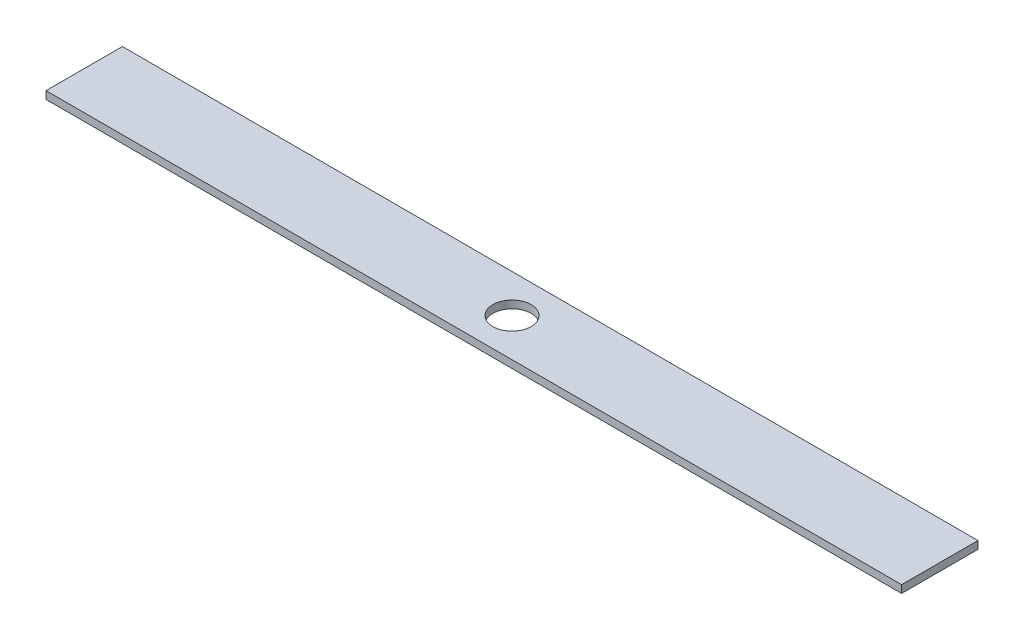
ISO-10303-21;
HEADER;
FILE_DESCRIPTION(('STEP AP214'),'2;1');
FILE_NAME('part.step','',(''),(''),'','','');
FILE_SCHEMA(('AUTOMOTIVE_DESIGN { 1 0 10303 214 1 1 1 1 }'));
ENDSEC;
DATA;
#1=APPLICATION_CONTEXT('core data for automotive mechanical design processes');
#2=APPLICATION_PROTOCOL_DEFINITION('international standard','automotive_design',2000,#1);
#3=PRODUCT_CONTEXT('',#1,'mechanical');
#4=PRODUCT('Part','Part','',(#3));
#5=PRODUCT_RELATED_PRODUCT_CATEGORY('part','',(#4));
#6=PRODUCT_DEFINITION_FORMATION('','',#4);
#7=PRODUCT_DEFINITION_CONTEXT('part definition',#1,'design');
#8=PRODUCT_DEFINITION('design','',#6,#7);
#9=PRODUCT_DEFINITION_SHAPE('','',#8);
#10=(LENGTH_UNIT() NAMED_UNIT(*) SI_UNIT(.MILLI.,.METRE.));
#11=(NAMED_UNIT(*) PLANE_ANGLE_UNIT() SI_UNIT($,.RADIAN.));
#12=(NAMED_UNIT(*) SI_UNIT($,.STERADIAN.) SOLID_ANGLE_UNIT());
#13=UNCERTAINTY_MEASURE_WITH_UNIT(LENGTH_MEASURE(1.E-05),#10,'distance_accuracy_value','');
#14=(GEOMETRIC_REPRESENTATION_CONTEXT(3) GLOBAL_UNCERTAINTY_ASSIGNED_CONTEXT((#13)) GLOBAL_UNIT_ASSIGNED_CONTEXT((#10,
#11,#12)) REPRESENTATION_CONTEXT('',''));
#15=CARTESIAN_POINT('',(0.,0.,0.));
#16=DIRECTION('',(0.,0.,1.));
#17=DIRECTION('',(1.,0.,0.));
#18=AXIS2_PLACEMENT_3D('',#15,#16,#17);
#19=CARTESIAN_POINT('',(0.,3.175,0.));
#20=DIRECTION('',(0.,-1.,0.));
#21=DIRECTION('',(0.,0.,-1.));
#22=AXIS2_PLACEMENT_3D('',#19,#20,#21);
#23=PLANE('',#22);
#24=DIRECTION('',(0.,0.,-1.));
#25=VECTOR('',#24,1.);
#26=CARTESIAN_POINT('',(177.8,3.175,15.875));
#27=LINE('',#26,#25);
#28=CARTESIAN_POINT('',(177.8,3.175,15.875));
#29=VERTEX_POINT('',#28);
#30=CARTESIAN_POINT('',(177.8,3.175,-15.875));
#31=VERTEX_POINT('',#30);
#32=EDGE_CURVE('E85',#29,#31,#27,.T.);
#33=ORIENTED_EDGE('',*,*,#32,.T.);
#34=DIRECTION('',(-1.,0.,0.));
#35=VECTOR('',#34,1.);
#36=CARTESIAN_POINT('',(-177.8,3.175,-15.875));
#37=LINE('',#36,#35);
#38=CARTESIAN_POINT('',(-177.8,3.175,-15.875));
#39=VERTEX_POINT('',#38);
#40=EDGE_CURVE('E80',#31,#39,#37,.T.);
#41=ORIENTED_EDGE('',*,*,#40,.T.);
#42=DIRECTION('',(0.,0.,1.));
#43=VECTOR('',#42,1.);
#44=CARTESIAN_POINT('',(-177.8,3.175,15.875));
#45=LINE('',#44,#43);
#46=CARTESIAN_POINT('',(-177.8,3.175,15.875));
#47=VERTEX_POINT('',#46);
#48=EDGE_CURVE('E83',#39,#47,#45,.T.);
#49=ORIENTED_EDGE('',*,*,#48,.T.);
#50=DIRECTION('',(1.,0.,0.));
#51=VECTOR('',#50,1.);
#52=CARTESIAN_POINT('',(-177.8,3.175,15.875));
#53=LINE('',#52,#51);
#54=EDGE_CURVE('E50',#47,#29,#53,.T.);
#55=ORIENTED_EDGE('',*,*,#54,.T.);
#56=EDGE_LOOP('',(#33,#41,#49,#55));
#57=FACE_BOUND('',#56,.T.);
#58=CARTESIAN_POINT('',(0.,3.175,0.));
#59=DIRECTION('',(0.,1.,0.));
#60=DIRECTION('',(0.,0.,1.));
#61=AXIS2_PLACEMENT_3D('',#58,#59,#60);
#62=CIRCLE('',#61,7.9375);
#63=CARTESIAN_POINT('',(0.,3.175,7.9375));
#64=VERTEX_POINT('',#63);
#65=EDGE_CURVE('E100',#64,#64,#62,.T.);
#66=ORIENTED_EDGE('',*,*,#65,.F.);
#67=EDGE_LOOP('',(#66));
#68=FACE_BOUND('',#67,.T.);
#69=ADVANCED_FACE('F33',(#57,#68),#23,.F.);
#70=CARTESIAN_POINT('',(0.,0.,0.));
#71=DIRECTION('',(0.,-1.,0.));
#72=DIRECTION('',(0.,0.,-1.));
#73=AXIS2_PLACEMENT_3D('',#70,#71,#72);
#74=PLANE('',#73);
#75=DIRECTION('',(0.,0.,-1.));
#76=VECTOR('',#75,1.);
#77=CARTESIAN_POINT('',(177.8,0.,15.875));
#78=LINE('',#77,#76);
#79=CARTESIAN_POINT('',(177.8,0.,15.875));
#80=VERTEX_POINT('',#79);
#81=CARTESIAN_POINT('',(177.8,0.,-15.875));
#82=VERTEX_POINT('',#81);
#83=EDGE_CURVE('E97',#80,#82,#78,.T.);
#84=ORIENTED_EDGE('',*,*,#83,.F.);
#85=DIRECTION('',(1.,0.,0.));
#86=VECTOR('',#85,1.);
#87=CARTESIAN_POINT('',(-177.8,0.,15.875));
#88=LINE('',#87,#86);
#89=CARTESIAN_POINT('',(-177.8,0.,15.875));
#90=VERTEX_POINT('',#89);
#91=EDGE_CURVE('E73',#90,#80,#88,.T.);
#92=ORIENTED_EDGE('',*,*,#91,.F.);
#93=DIRECTION('',(0.,0.,1.));
#94=VECTOR('',#93,1.);
#95=CARTESIAN_POINT('',(-177.8,0.,15.875));
#96=LINE('',#95,#94);
#97=CARTESIAN_POINT('',(-177.8,0.,-15.875));
#98=VERTEX_POINT('',#97);
#99=EDGE_CURVE('E67',#98,#90,#96,.T.);
#100=ORIENTED_EDGE('',*,*,#99,.F.);
#101=DIRECTION('',(-1.,0.,0.));
#102=VECTOR('',#101,1.);
#103=CARTESIAN_POINT('',(-177.8,0.,-15.875));
#104=LINE('',#103,#102);
#105=EDGE_CURVE('E89',#82,#98,#104,.T.);
#106=ORIENTED_EDGE('',*,*,#105,.F.);
#107=EDGE_LOOP('',(#84,#92,#100,#106));
#108=FACE_BOUND('',#107,.T.);
#109=CARTESIAN_POINT('',(0.,0.,0.));
#110=DIRECTION('',(0.,1.,0.));
#111=DIRECTION('',(0.,0.,1.));
#112=AXIS2_PLACEMENT_3D('',#109,#110,#111);
#113=CIRCLE('',#112,7.9375);
#114=CARTESIAN_POINT('',(0.,0.,7.9375));
#115=VERTEX_POINT('',#114);
#116=EDGE_CURVE('E112',#115,#115,#113,.T.);
#117=ORIENTED_EDGE('',*,*,#116,.T.);
#118=EDGE_LOOP('',(#117));
#119=FACE_BOUND('',#118,.T.);
#120=ADVANCED_FACE('F108',(#108,#119),#74,.T.);
#121=CARTESIAN_POINT('',(177.8,3.175,15.875));
#122=DIRECTION('',(-1.,0.,0.));
#123=DIRECTION('',(0.,0.,1.));
#124=AXIS2_PLACEMENT_3D('',#121,#122,#123);
#125=PLANE('',#124);
#126=ORIENTED_EDGE('',*,*,#83,.T.);
#127=DIRECTION('',(0.,-1.,0.));
#128=VECTOR('',#127,1.);
#129=CARTESIAN_POINT('',(177.8,3.175,-15.875));
#130=LINE('',#129,#128);
#131=EDGE_CURVE('E11',#31,#82,#130,.T.);
#132=ORIENTED_EDGE('',*,*,#131,.F.);
#133=ORIENTED_EDGE('',*,*,#32,.F.);
#134=DIRECTION('',(0.,-1.,0.));
#135=VECTOR('',#134,1.);
#136=CARTESIAN_POINT('',(177.8,3.175,15.875));
#137=LINE('',#136,#135);
#138=EDGE_CURVE('E93',#29,#80,#137,.T.);
#139=ORIENTED_EDGE('',*,*,#138,.T.);
#140=EDGE_LOOP('',(#126,#132,#133,#139));
#141=FACE_BOUND('',#140,.T.);
#142=ADVANCED_FACE('F35',(#141),#125,.F.);
#143=CARTESIAN_POINT('',(-177.8,3.175,-15.875));
#144=DIRECTION('',(0.,0.,1.));
#145=DIRECTION('',(1.,0.,0.));
#146=AXIS2_PLACEMENT_3D('',#143,#144,#145);
#147=PLANE('',#146);
#148=ORIENTED_EDGE('',*,*,#105,.T.);
#149=DIRECTION('',(0.,-1.,0.));
#150=VECTOR('',#149,1.);
#151=CARTESIAN_POINT('',(-177.8,3.175,-15.875));
#152=LINE('',#151,#150);
#153=EDGE_CURVE('E42',#39,#98,#152,.T.);
#154=ORIENTED_EDGE('',*,*,#153,.F.);
#155=ORIENTED_EDGE('',*,*,#40,.F.);
#156=ORIENTED_EDGE('',*,*,#131,.T.);
#157=EDGE_LOOP('',(#148,#154,#155,#156));
#158=FACE_BOUND('',#157,.T.);
#159=ADVANCED_FACE('F88',(#158),#147,.F.);
#160=CARTESIAN_POINT('',(-177.8,3.175,15.875));
#161=DIRECTION('',(1.,0.,0.));
#162=DIRECTION('',(0.,0.,-1.));
#163=AXIS2_PLACEMENT_3D('',#160,#161,#162);
#164=PLANE('',#163);
#165=ORIENTED_EDGE('',*,*,#99,.T.);
#166=DIRECTION('',(0.,-1.,0.));
#167=VECTOR('',#166,1.);
#168=CARTESIAN_POINT('',(-177.8,3.175,15.875));
#169=LINE('',#168,#167);
#170=EDGE_CURVE('E90',#47,#90,#169,.T.);
#171=ORIENTED_EDGE('',*,*,#170,.F.);
#172=ORIENTED_EDGE('',*,*,#48,.F.);
#173=ORIENTED_EDGE('',*,*,#153,.T.);
#174=EDGE_LOOP('',(#165,#171,#172,#173));
#175=FACE_BOUND('',#174,.T.);
#176=ADVANCED_FACE('F91',(#175),#164,.F.);
#177=CARTESIAN_POINT('',(-177.8,3.175,15.875));
#178=DIRECTION('',(0.,0.,-1.));
#179=DIRECTION('',(-1.,0.,0.));
#180=AXIS2_PLACEMENT_3D('',#177,#178,#179);
#181=PLANE('',#180);
#182=ORIENTED_EDGE('',*,*,#91,.T.);
#183=ORIENTED_EDGE('',*,*,#138,.F.);
#184=ORIENTED_EDGE('',*,*,#54,.F.);
#185=ORIENTED_EDGE('',*,*,#170,.T.);
#186=EDGE_LOOP('',(#182,#183,#184,#185));
#187=FACE_BOUND('',#186,.T.);
#188=ADVANCED_FACE('F105',(#187),#181,.F.);
#189=CARTESIAN_POINT('',(0.,3.175,0.));
#190=DIRECTION('',(0.,-1.,0.));
#191=DIRECTION('',(0.,0.,-1.));
#192=AXIS2_PLACEMENT_3D('',#189,#190,#191);
#193=CYLINDRICAL_SURFACE('',#192,7.9375);
#194=ORIENTED_EDGE('',*,*,#65,.T.);
#195=EDGE_LOOP('',(#194));
#196=FACE_BOUND('',#195,.T.);
#197=ORIENTED_EDGE('',*,*,#116,.F.);
#198=EDGE_LOOP('',(#197));
#199=FACE_BOUND('',#198,.T.);
#200=ADVANCED_FACE('F118',(#196,#199),#193,.F.);
#201=CLOSED_SHELL('',(#69,#120,#142,#159,#176,#188,#200));
#202=MANIFOLD_SOLID_BREP('B2',#201);
#203=ADVANCED_BREP_SHAPE_REPRESENTATION('',(#18,#202),#14);
#204=SHAPE_DEFINITION_REPRESENTATION(#9,#203);
ENDSEC;
END-ISO-10303-21;
